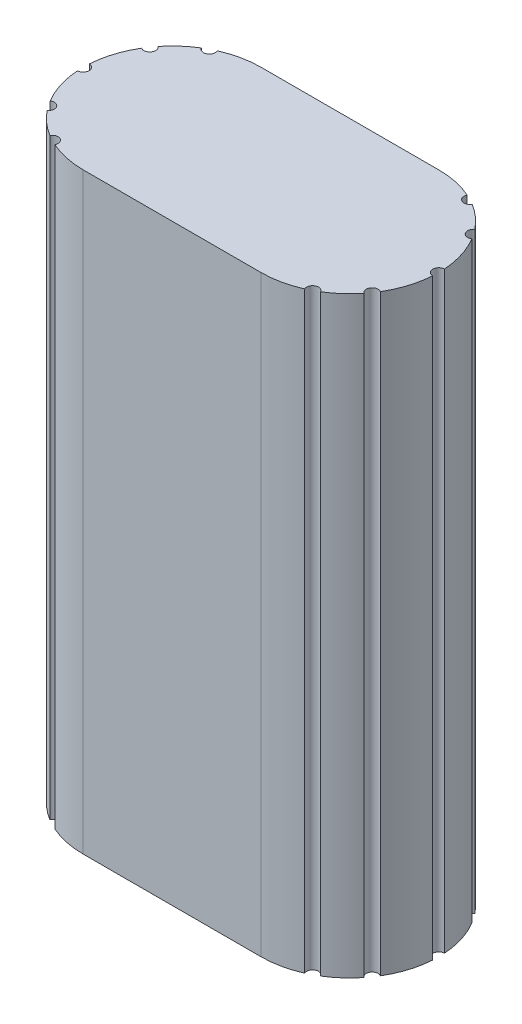
ISO-10303-21;
HEADER;
FILE_DESCRIPTION(('STEP AP214'),'2;1');
FILE_NAME('part.step','',(''),(''),'','','');
FILE_SCHEMA(('AUTOMOTIVE_DESIGN { 1 0 10303 214 1 1 1 1 }'));
ENDSEC;
DATA;
#1=APPLICATION_CONTEXT('core data for automotive mechanical design processes');
#2=APPLICATION_PROTOCOL_DEFINITION('international standard','automotive_design',2000,#1);
#3=PRODUCT_CONTEXT('',#1,'mechanical');
#4=PRODUCT('Part','Part','',(#3));
#5=PRODUCT_RELATED_PRODUCT_CATEGORY('part','',(#4));
#6=PRODUCT_DEFINITION_FORMATION('','',#4);
#7=PRODUCT_DEFINITION_CONTEXT('part definition',#1,'design');
#8=PRODUCT_DEFINITION('design','',#6,#7);
#9=PRODUCT_DEFINITION_SHAPE('','',#8);
#10=(LENGTH_UNIT() NAMED_UNIT(*) SI_UNIT(.MILLI.,.METRE.));
#11=(NAMED_UNIT(*) PLANE_ANGLE_UNIT() SI_UNIT($,.RADIAN.));
#12=(NAMED_UNIT(*) SI_UNIT($,.STERADIAN.) SOLID_ANGLE_UNIT());
#13=UNCERTAINTY_MEASURE_WITH_UNIT(LENGTH_MEASURE(1.E-05),#10,'distance_accuracy_value','');
#14=(GEOMETRIC_REPRESENTATION_CONTEXT(3) GLOBAL_UNCERTAINTY_ASSIGNED_CONTEXT((#13)) GLOBAL_UNIT_ASSIGNED_CONTEXT((#10,
#11,#12)) REPRESENTATION_CONTEXT('',''));
#15=CARTESIAN_POINT('',(0.,0.,0.));
#16=DIRECTION('',(0.,0.,1.));
#17=DIRECTION('',(1.,0.,0.));
#18=AXIS2_PLACEMENT_3D('',#15,#16,#17);
#19=CARTESIAN_POINT('',(15.,100.,0.));
#20=DIRECTION('',(0.,-1.,0.));
#21=DIRECTION('',(0.,0.,-1.));
#22=AXIS2_PLACEMENT_3D('',#19,#20,#21);
#23=CYLINDRICAL_SURFACE('',#22,15.);
#24=CARTESIAN_POINT('',(15.,0.,0.));
#25=DIRECTION('',(0.,1.,0.));
#26=DIRECTION('',(0.,0.,1.));
#27=AXIS2_PLACEMENT_3D('',#24,#25,#26);
#28=CIRCLE('',#27,15.);
#29=CARTESIAN_POINT('',(26.7246512257191,0.,-9.35588337011761));
#30=VERTEX_POINT('',#29);
#31=CARTESIAN_POINT('',(22.8513458778953,0.,-12.7810941591734));
#32=VERTEX_POINT('',#31);
#33=EDGE_CURVE('E277',#30,#32,#28,.T.);
#34=ORIENTED_EDGE('',*,*,#33,.T.);
#35=DIRECTION('',(0.,1.,0.));
#36=VECTOR('',#35,1.);
#37=CARTESIAN_POINT('',(22.8513458778952,50.,-12.7810941591734));
#38=LINE('',#37,#36);
#39=CARTESIAN_POINT('',(22.8513458778952,100.,-12.7810941591734));
#40=VERTEX_POINT('',#39);
#41=EDGE_CURVE('E278',#32,#40,#38,.T.);
#42=ORIENTED_EDGE('',*,*,#41,.T.);
#43=CARTESIAN_POINT('',(15.,100.,0.));
#44=DIRECTION('',(0.,1.,0.));
#45=DIRECTION('',(0.,0.,1.));
#46=AXIS2_PLACEMENT_3D('',#43,#44,#45);
#47=CIRCLE('',#46,15.);
#48=CARTESIAN_POINT('',(26.7246512257191,100.,-9.35588337011761));
#49=VERTEX_POINT('',#48);
#50=EDGE_CURVE('E355',#49,#40,#47,.T.);
#51=ORIENTED_EDGE('',*,*,#50,.F.);
#52=DIRECTION('',(0.,1.,0.));
#53=VECTOR('',#52,1.);
#54=CARTESIAN_POINT('',(26.7246512257191,50.,-9.35588337011761));
#55=LINE('',#54,#53);
#56=EDGE_CURVE('E337',#49,#30,#55,.F.);
#57=ORIENTED_EDGE('',*,*,#56,.T.);
#58=EDGE_LOOP('',(#34,#42,#51,#57));
#59=FACE_BOUND('',#58,.T.);
#60=ADVANCED_FACE('F33',(#59),#23,.T.);
#61=CARTESIAN_POINT('',(29.9666666666667,0.,-0.99944429003768));
#62=VERTEX_POINT('',#61);
#63=CARTESIAN_POINT('',(27.8645352246402,0.,-7.71386631035257));
#64=VERTEX_POINT('',#63);
#65=EDGE_CURVE('E283',#62,#64,#28,.T.);
#66=ORIENTED_EDGE('',*,*,#65,.T.);
#67=DIRECTION('',(0.,1.,0.));
#68=VECTOR('',#67,1.);
#69=CARTESIAN_POINT('',(27.8645352246402,50.,-7.71386631035259));
#70=LINE('',#69,#68);
#71=CARTESIAN_POINT('',(27.8645352246402,100.,-7.71386631035259));
#72=VERTEX_POINT('',#71);
#73=EDGE_CURVE('E290',#64,#72,#70,.T.);
#74=ORIENTED_EDGE('',*,*,#73,.T.);
#75=CARTESIAN_POINT('',(29.9666666666667,100.,-0.99944429003768));
#76=VERTEX_POINT('',#75);
#77=EDGE_CURVE('E345',#76,#72,#47,.T.);
#78=ORIENTED_EDGE('',*,*,#77,.F.);
#79=DIRECTION('',(0.,1.,0.));
#80=VECTOR('',#79,1.);
#81=CARTESIAN_POINT('',(29.9666666666667,50.,-0.99944429003768));
#82=LINE('',#81,#80);
#83=EDGE_CURVE('E331',#76,#62,#82,.F.);
#84=ORIENTED_EDGE('',*,*,#83,.T.);
#85=EDGE_LOOP('',(#66,#74,#78,#84));
#86=FACE_BOUND('',#85,.T.);
#87=ADVANCED_FACE('F344',(#86),#23,.T.);
#88=CARTESIAN_POINT('',(27.8645352246402,0.,7.71386631035257));
#89=VERTEX_POINT('',#88);
#90=CARTESIAN_POINT('',(29.9666666666667,0.,0.99944429003765));
#91=VERTEX_POINT('',#90);
#92=EDGE_CURVE('E275',#89,#91,#28,.T.);
#93=ORIENTED_EDGE('',*,*,#92,.T.);
#94=DIRECTION('',(0.,1.,0.));
#95=VECTOR('',#94,1.);
#96=CARTESIAN_POINT('',(29.9666666666667,50.,0.99944429003765));
#97=LINE('',#96,#95);
#98=CARTESIAN_POINT('',(29.9666666666667,100.,0.99944429003765));
#99=VERTEX_POINT('',#98);
#100=EDGE_CURVE('E334',#91,#99,#97,.T.);
#101=ORIENTED_EDGE('',*,*,#100,.T.);
#102=CARTESIAN_POINT('',(27.8645352246402,100.,7.71386631035257));
#103=VERTEX_POINT('',#102);
#104=EDGE_CURVE('E354',#103,#99,#47,.T.);
#105=ORIENTED_EDGE('',*,*,#104,.F.);
#106=DIRECTION('',(0.,1.,0.));
#107=VECTOR('',#106,1.);
#108=CARTESIAN_POINT('',(27.8645352246402,50.,7.71386631035257));
#109=LINE('',#108,#107);
#110=EDGE_CURVE('E318',#103,#89,#109,.F.);
#111=ORIENTED_EDGE('',*,*,#110,.T.);
#112=EDGE_LOOP('',(#93,#101,#105,#111));
#113=FACE_BOUND('',#112,.T.);
#114=ADVANCED_FACE('F380',(#113),#23,.T.);
#115=CARTESIAN_POINT('',(22.8513458778953,0.,12.7810941591734));
#116=VERTEX_POINT('',#115);
#117=CARTESIAN_POINT('',(26.7246512257191,0.,9.35588337011761));
#118=VERTEX_POINT('',#117);
#119=EDGE_CURVE('E269',#116,#118,#28,.T.);
#120=ORIENTED_EDGE('',*,*,#119,.T.);
#121=DIRECTION('',(0.,1.,0.));
#122=VECTOR('',#121,1.);
#123=CARTESIAN_POINT('',(26.7246512257191,50.,9.35588337011759));
#124=LINE('',#123,#122);
#125=CARTESIAN_POINT('',(26.7246512257191,100.,9.35588337011759));
#126=VERTEX_POINT('',#125);
#127=EDGE_CURVE('E322',#118,#126,#124,.T.);
#128=ORIENTED_EDGE('',*,*,#127,.T.);
#129=CARTESIAN_POINT('',(22.8513458778953,100.,12.7810941591734));
#130=VERTEX_POINT('',#129);
#131=EDGE_CURVE('E298',#130,#126,#47,.T.);
#132=ORIENTED_EDGE('',*,*,#131,.F.);
#133=DIRECTION('',(0.,1.,0.));
#134=VECTOR('',#133,1.);
#135=CARTESIAN_POINT('',(22.8513458778953,50.,12.7810941591734));
#136=LINE('',#135,#134);
#137=EDGE_CURVE('E319',#130,#116,#136,.F.);
#138=ORIENTED_EDGE('',*,*,#137,.T.);
#139=EDGE_LOOP('',(#120,#128,#132,#138));
#140=FACE_BOUND('',#139,.T.);
#141=ADVANCED_FACE('F373',(#140),#23,.T.);
#142=CARTESIAN_POINT('',(15.,0.,15.));
#143=VERTEX_POINT('',#142);
#144=CARTESIAN_POINT('',(21.082219690266,0.,13.7115500086365));
#145=VERTEX_POINT('',#144);
#146=EDGE_CURVE('E264',#143,#145,#28,.T.);
#147=ORIENTED_EDGE('',*,*,#146,.T.);
#148=DIRECTION('',(0.,1.,0.));
#149=VECTOR('',#148,1.);
#150=CARTESIAN_POINT('',(21.082219690266,50.,13.7115500086365));
#151=LINE('',#150,#149);
#152=CARTESIAN_POINT('',(21.082219690266,100.,13.7115500086365));
#153=VERTEX_POINT('',#152);
#154=EDGE_CURVE('E316',#145,#153,#151,.T.);
#155=ORIENTED_EDGE('',*,*,#154,.T.);
#156=CARTESIAN_POINT('',(15.,100.,15.));
#157=VERTEX_POINT('',#156);
#158=EDGE_CURVE('E294',#157,#153,#47,.T.);
#159=ORIENTED_EDGE('',*,*,#158,.F.);
#160=DIRECTION('',(0.,-1.,0.));
#161=VECTOR('',#160,1.);
#162=CARTESIAN_POINT('',(15.,100.,15.));
#163=LINE('',#162,#161);
#164=EDGE_CURVE('E234',#157,#143,#163,.T.);
#165=ORIENTED_EDGE('',*,*,#164,.T.);
#166=EDGE_LOOP('',(#147,#155,#159,#165));
#167=FACE_BOUND('',#166,.T.);
#168=ADVANCED_FACE('F315',(#167),#23,.T.);
#169=CARTESIAN_POINT('',(-15.,100.,0.));
#170=DIRECTION('',(0.,-1.,0.));
#171=DIRECTION('',(0.,0.,-1.));
#172=AXIS2_PLACEMENT_3D('',#169,#170,#171);
#173=CYLINDRICAL_SURFACE('',#172,15.);
#174=CARTESIAN_POINT('',(-15.,0.,0.));
#175=DIRECTION('',(0.,1.,0.));
#176=DIRECTION('',(0.,0.,1.));
#177=AXIS2_PLACEMENT_3D('',#174,#175,#176);
#178=CIRCLE('',#177,15.);
#179=CARTESIAN_POINT('',(-27.8645352246402,0.,-7.71386631035258));
#180=VERTEX_POINT('',#179);
#181=CARTESIAN_POINT('',(-29.9666666666667,0.,-0.999444290037663));
#182=VERTEX_POINT('',#181);
#183=EDGE_CURVE('E222',#180,#182,#178,.T.);
#184=ORIENTED_EDGE('',*,*,#183,.T.);
#185=DIRECTION('',(0.,1.,0.));
#186=VECTOR('',#185,1.);
#187=CARTESIAN_POINT('',(-29.9666666666667,50.,-0.999444290037662));
#188=LINE('',#187,#186);
#189=CARTESIAN_POINT('',(-29.9666666666667,100.,-0.999444290037662));
#190=VERTEX_POINT('',#189);
#191=EDGE_CURVE('E325',#182,#190,#188,.T.);
#192=ORIENTED_EDGE('',*,*,#191,.T.);
#193=CARTESIAN_POINT('',(-15.,100.,0.));
#194=DIRECTION('',(0.,1.,0.));
#195=DIRECTION('',(0.,0.,1.));
#196=AXIS2_PLACEMENT_3D('',#193,#194,#195);
#197=CIRCLE('',#196,15.);
#198=CARTESIAN_POINT('',(-27.8645352246402,100.,-7.71386631035258));
#199=VERTEX_POINT('',#198);
#200=EDGE_CURVE('E430',#199,#190,#197,.T.);
#201=ORIENTED_EDGE('',*,*,#200,.F.);
#202=DIRECTION('',(0.,1.,0.));
#203=VECTOR('',#202,1.);
#204=CARTESIAN_POINT('',(-27.8645352246402,50.,-7.71386631035258));
#205=LINE('',#204,#203);
#206=EDGE_CURVE('E419',#199,#180,#205,.F.);
#207=ORIENTED_EDGE('',*,*,#206,.T.);
#208=EDGE_LOOP('',(#184,#192,#201,#207));
#209=FACE_BOUND('',#208,.T.);
#210=ADVANCED_FACE('F372',(#209),#173,.T.);
#211=CARTESIAN_POINT('',(-26.7246512257191,0.,9.35588337011761));
#212=VERTEX_POINT('',#211);
#213=CARTESIAN_POINT('',(-22.8513458778953,0.,12.7810941591734));
#214=VERTEX_POINT('',#213);
#215=EDGE_CURVE('E251',#212,#214,#178,.T.);
#216=ORIENTED_EDGE('',*,*,#215,.T.);
#217=DIRECTION('',(0.,1.,0.));
#218=VECTOR('',#217,1.);
#219=CARTESIAN_POINT('',(-22.8513458778952,50.,12.7810941591734));
#220=LINE('',#219,#218);
#221=CARTESIAN_POINT('',(-22.8513458778952,100.,12.7810941591734));
#222=VERTEX_POINT('',#221);
#223=EDGE_CURVE('E48',#214,#222,#220,.T.);
#224=ORIENTED_EDGE('',*,*,#223,.T.);
#225=CARTESIAN_POINT('',(-26.7246512257191,100.,9.35588337011761));
#226=VERTEX_POINT('',#225);
#227=EDGE_CURVE('E437',#226,#222,#197,.T.);
#228=ORIENTED_EDGE('',*,*,#227,.F.);
#229=DIRECTION('',(0.,1.,0.));
#230=VECTOR('',#229,1.);
#231=CARTESIAN_POINT('',(-26.7246512257191,50.,9.35588337011761));
#232=LINE('',#231,#230);
#233=EDGE_CURVE('E416',#226,#212,#232,.F.);
#234=ORIENTED_EDGE('',*,*,#233,.T.);
#235=EDGE_LOOP('',(#216,#224,#228,#234));
#236=FACE_BOUND('',#235,.T.);
#237=ADVANCED_FACE('F378',(#236),#173,.T.);
#238=CARTESIAN_POINT('',(-22.8513458778952,0.,-12.7810941591734));
#239=VERTEX_POINT('',#238);
#240=CARTESIAN_POINT('',(-26.7246512257191,0.,-9.35588337011762));
#241=VERTEX_POINT('',#240);
#242=EDGE_CURVE('E212',#239,#241,#178,.T.);
#243=ORIENTED_EDGE('',*,*,#242,.T.);
#244=DIRECTION('',(0.,1.,0.));
#245=VECTOR('',#244,1.);
#246=CARTESIAN_POINT('',(-26.7246512257191,50.,-9.3558833701176));
#247=LINE('',#246,#245);
#248=CARTESIAN_POINT('',(-26.7246512257191,100.,-9.3558833701176));
#249=VERTEX_POINT('',#248);
#250=EDGE_CURVE('E422',#241,#249,#247,.T.);
#251=ORIENTED_EDGE('',*,*,#250,.T.);
#252=CARTESIAN_POINT('',(-22.8513458778952,100.,-12.7810941591734));
#253=VERTEX_POINT('',#252);
#254=EDGE_CURVE('E214',#253,#249,#197,.T.);
#255=ORIENTED_EDGE('',*,*,#254,.F.);
#256=DIRECTION('',(0.,1.,0.));
#257=VECTOR('',#256,1.);
#258=CARTESIAN_POINT('',(-22.8513458778952,50.,-12.7810941591734));
#259=LINE('',#258,#257);
#260=EDGE_CURVE('E196',#253,#239,#259,.F.);
#261=ORIENTED_EDGE('',*,*,#260,.T.);
#262=EDGE_LOOP('',(#243,#251,#255,#261));
#263=FACE_BOUND('',#262,.T.);
#264=ADVANCED_FACE('F210',(#263),#173,.T.);
#265=CARTESIAN_POINT('',(-29.9666666666667,100.,0.999444290037667));
#266=VERTEX_POINT('',#265);
#267=CARTESIAN_POINT('',(-27.8645352246402,100.,7.71386631035259));
#268=VERTEX_POINT('',#267);
#269=EDGE_CURVE('E436',#266,#268,#197,.T.);
#270=ORIENTED_EDGE('',*,*,#269,.F.);
#271=DIRECTION('',(0.,1.,0.));
#272=VECTOR('',#271,1.);
#273=CARTESIAN_POINT('',(-29.9666666666667,50.,0.999444290037667));
#274=LINE('',#273,#272);
#275=CARTESIAN_POINT('',(-29.9666666666667,0.,0.999444290037667));
#276=VERTEX_POINT('',#275);
#277=EDGE_CURVE('E258',#266,#276,#274,.F.);
#278=ORIENTED_EDGE('',*,*,#277,.T.);
#279=CARTESIAN_POINT('',(-27.8645352246402,0.,7.71386631035256));
#280=VERTEX_POINT('',#279);
#281=EDGE_CURVE('E227',#276,#280,#178,.T.);
#282=ORIENTED_EDGE('',*,*,#281,.T.);
#283=DIRECTION('',(0.,1.,0.));
#284=VECTOR('',#283,1.);
#285=CARTESIAN_POINT('',(-27.8645352246402,50.,7.71386631035259));
#286=LINE('',#285,#284);
#287=EDGE_CURVE('E56',#280,#268,#286,.T.);
#288=ORIENTED_EDGE('',*,*,#287,.T.);
#289=EDGE_LOOP('',(#270,#278,#282,#288));
#290=FACE_BOUND('',#289,.T.);
#291=ADVANCED_FACE('F256',(#290),#173,.T.);
#292=CARTESIAN_POINT('',(-15.,0.,-15.));
#293=VERTEX_POINT('',#292);
#294=CARTESIAN_POINT('',(-21.082219690266,0.,-13.7115500086365));
#295=VERTEX_POINT('',#294);
#296=EDGE_CURVE('E221',#293,#295,#178,.T.);
#297=ORIENTED_EDGE('',*,*,#296,.T.);
#298=DIRECTION('',(0.,1.,0.));
#299=VECTOR('',#298,1.);
#300=CARTESIAN_POINT('',(-21.082219690266,50.,-13.7115500086365));
#301=LINE('',#300,#299);
#302=CARTESIAN_POINT('',(-21.082219690266,100.,-13.7115500086365));
#303=VERTEX_POINT('',#302);
#304=EDGE_CURVE('E199',#295,#303,#301,.T.);
#305=ORIENTED_EDGE('',*,*,#304,.T.);
#306=CARTESIAN_POINT('',(-15.,100.,-15.));
#307=VERTEX_POINT('',#306);
#308=EDGE_CURVE('E301',#307,#303,#197,.T.);
#309=ORIENTED_EDGE('',*,*,#308,.F.);
#310=DIRECTION('',(0.,-1.,0.));
#311=VECTOR('',#310,1.);
#312=CARTESIAN_POINT('',(-15.,100.,-15.));
#313=LINE('',#312,#311);
#314=EDGE_CURVE('E241',#307,#293,#313,.T.);
#315=ORIENTED_EDGE('',*,*,#314,.T.);
#316=EDGE_LOOP('',(#297,#305,#309,#315));
#317=FACE_BOUND('',#316,.T.);
#318=ADVANCED_FACE('F362',(#317),#173,.T.);
#319=CARTESIAN_POINT('',(21.082219690266,100.,-13.7115500086365));
#320=VERTEX_POINT('',#319);
#321=CARTESIAN_POINT('',(15.,100.,-15.));
#322=VERTEX_POINT('',#321);
#323=EDGE_CURVE('E233',#320,#322,#47,.T.);
#324=ORIENTED_EDGE('',*,*,#323,.F.);
#325=DIRECTION('',(0.,1.,0.));
#326=VECTOR('',#325,1.);
#327=CARTESIAN_POINT('',(21.082219690266,50.,-13.7115500086365));
#328=LINE('',#327,#326);
#329=CARTESIAN_POINT('',(21.082219690266,0.,-13.7115500086365));
#330=VERTEX_POINT('',#329);
#331=EDGE_CURVE('E285',#320,#330,#328,.F.);
#332=ORIENTED_EDGE('',*,*,#331,.T.);
#333=CARTESIAN_POINT('',(15.,0.,-15.));
#334=VERTEX_POINT('',#333);
#335=EDGE_CURVE('E270',#330,#334,#28,.T.);
#336=ORIENTED_EDGE('',*,*,#335,.T.);
#337=DIRECTION('',(0.,-1.,0.));
#338=VECTOR('',#337,1.);
#339=CARTESIAN_POINT('',(15.,100.,-15.));
#340=LINE('',#339,#338);
#341=EDGE_CURVE('E205',#322,#334,#340,.T.);
#342=ORIENTED_EDGE('',*,*,#341,.F.);
#343=EDGE_LOOP('',(#324,#332,#336,#342));
#344=FACE_BOUND('',#343,.T.);
#345=ADVANCED_FACE('F35',(#344),#23,.T.);
#346=CARTESIAN_POINT('',(15.,100.,-15.));
#347=DIRECTION('',(0.,0.,1.));
#348=DIRECTION('',(1.,0.,0.));
#349=AXIS2_PLACEMENT_3D('',#346,#347,#348);
#350=PLANE('',#349);
#351=DIRECTION('',(-1.,0.,0.));
#352=VECTOR('',#351,1.);
#353=CARTESIAN_POINT('',(15.,0.,-15.));
#354=LINE('',#353,#352);
#355=EDGE_CURVE('E230',#334,#293,#354,.T.);
#356=ORIENTED_EDGE('',*,*,#355,.T.);
#357=ORIENTED_EDGE('',*,*,#314,.F.);
#358=DIRECTION('',(-1.,0.,0.));
#359=VECTOR('',#358,1.);
#360=CARTESIAN_POINT('',(15.,100.,-15.));
#361=LINE('',#360,#359);
#362=EDGE_CURVE('E297',#322,#307,#361,.T.);
#363=ORIENTED_EDGE('',*,*,#362,.F.);
#364=ORIENTED_EDGE('',*,*,#341,.T.);
#365=EDGE_LOOP('',(#356,#357,#363,#364));
#366=FACE_BOUND('',#365,.T.);
#367=ADVANCED_FACE('F359',(#366),#350,.F.);
#368=CARTESIAN_POINT('',(-21.082219690266,100.,13.7115500086365));
#369=VERTEX_POINT('',#368);
#370=CARTESIAN_POINT('',(-15.,100.,15.));
#371=VERTEX_POINT('',#370);
#372=EDGE_CURVE('E300',#369,#371,#197,.T.);
#373=ORIENTED_EDGE('',*,*,#372,.F.);
#374=DIRECTION('',(0.,1.,0.));
#375=VECTOR('',#374,1.);
#376=CARTESIAN_POINT('',(-21.082219690266,50.,13.7115500086365));
#377=LINE('',#376,#375);
#378=CARTESIAN_POINT('',(-21.082219690266,0.,13.7115500086365));
#379=VERTEX_POINT('',#378);
#380=EDGE_CURVE('E424',#369,#379,#377,.F.);
#381=ORIENTED_EDGE('',*,*,#380,.T.);
#382=CARTESIAN_POINT('',(-15.,0.,15.));
#383=VERTEX_POINT('',#382);
#384=EDGE_CURVE('E225',#379,#383,#178,.T.);
#385=ORIENTED_EDGE('',*,*,#384,.T.);
#386=DIRECTION('',(0.,-1.,0.));
#387=VECTOR('',#386,1.);
#388=CARTESIAN_POINT('',(-15.,100.,15.));
#389=LINE('',#388,#387);
#390=EDGE_CURVE('E237',#371,#383,#389,.T.);
#391=ORIENTED_EDGE('',*,*,#390,.F.);
#392=EDGE_LOOP('',(#373,#381,#385,#391));
#393=FACE_BOUND('',#392,.T.);
#394=ADVANCED_FACE('F367',(#393),#173,.T.);
#395=CARTESIAN_POINT('',(15.,100.,15.));
#396=DIRECTION('',(0.,0.,-1.));
#397=DIRECTION('',(-1.,0.,0.));
#398=AXIS2_PLACEMENT_3D('',#395,#396,#397);
#399=PLANE('',#398);
#400=DIRECTION('',(1.,0.,0.));
#401=VECTOR('',#400,1.);
#402=CARTESIAN_POINT('',(15.,0.,15.));
#403=LINE('',#402,#401);
#404=EDGE_CURVE('E224',#383,#143,#403,.T.);
#405=ORIENTED_EDGE('',*,*,#404,.T.);
#406=ORIENTED_EDGE('',*,*,#164,.F.);
#407=DIRECTION('',(1.,0.,0.));
#408=VECTOR('',#407,1.);
#409=CARTESIAN_POINT('',(15.,100.,15.));
#410=LINE('',#409,#408);
#411=EDGE_CURVE('E238',#371,#157,#410,.T.);
#412=ORIENTED_EDGE('',*,*,#411,.F.);
#413=ORIENTED_EDGE('',*,*,#390,.T.);
#414=EDGE_LOOP('',(#405,#406,#412,#413));
#415=FACE_BOUND('',#414,.T.);
#416=ADVANCED_FACE('F313',(#415),#399,.F.);
#417=CARTESIAN_POINT('',(15.,100.,0.));
#418=DIRECTION('',(0.,1.,0.));
#419=DIRECTION('',(0.,0.,1.));
#420=AXIS2_PLACEMENT_3D('',#417,#418,#419);
#421=PLANE('',#420);
#422=CARTESIAN_POINT('',(21.9822990040897,100.,-13.2758239148268));
#423=DIRECTION('',(0.,1.,0.));
#424=DIRECTION('',(0.,0.,-1.));
#425=AXIS2_PLACEMENT_3D('',#422,#423,#424);
#426=CIRCLE('',#425,1.);
#427=EDGE_CURVE('E358',#320,#40,#426,.T.);
#428=ORIENTED_EDGE('',*,*,#427,.F.);
#429=ORIENTED_EDGE('',*,*,#323,.T.);
#430=ORIENTED_EDGE('',*,*,#362,.T.);
#431=ORIENTED_EDGE('',*,*,#308,.T.);
#432=CARTESIAN_POINT('',(-21.9822990040897,100.,-13.2758239148268));
#433=DIRECTION('',(0.,1.,0.));
#434=DIRECTION('',(0.,0.,1.));
#435=AXIS2_PLACEMENT_3D('',#432,#433,#434);
#436=CIRCLE('',#435,1.);
#437=EDGE_CURVE('E215',#253,#303,#436,.T.);
#438=ORIENTED_EDGE('',*,*,#437,.F.);
#439=ORIENTED_EDGE('',*,*,#254,.T.);
#440=CARTESIAN_POINT('',(-27.321975392719,100.,-8.5538834701688));
#441=DIRECTION('',(0.,1.,0.));
#442=DIRECTION('',(0.,0.,1.));
#443=AXIS2_PLACEMENT_3D('',#440,#441,#442);
#444=CIRCLE('',#443,1.);
#445=EDGE_CURVE('E435',#199,#249,#444,.T.);
#446=ORIENTED_EDGE('',*,*,#445,.F.);
#447=ORIENTED_EDGE('',*,*,#200,.T.);
#448=CARTESIAN_POINT('',(-30.,100.,0.));
#449=DIRECTION('',(0.,1.,0.));
#450=DIRECTION('',(0.,0.,1.));
#451=AXIS2_PLACEMENT_3D('',#448,#449,#450);
#452=CIRCLE('',#451,1.);
#453=EDGE_CURVE('E434',#266,#190,#452,.T.);
#454=ORIENTED_EDGE('',*,*,#453,.F.);
#455=ORIENTED_EDGE('',*,*,#269,.T.);
#456=CARTESIAN_POINT('',(-27.321975392719,100.,8.5538834701688));
#457=DIRECTION('',(0.,1.,0.));
#458=DIRECTION('',(0.,0.,-1.));
#459=AXIS2_PLACEMENT_3D('',#456,#457,#458);
#460=CIRCLE('',#459,1.);
#461=EDGE_CURVE('E398',#226,#268,#460,.T.);
#462=ORIENTED_EDGE('',*,*,#461,.F.);
#463=ORIENTED_EDGE('',*,*,#227,.T.);
#464=CARTESIAN_POINT('',(-21.9822990040897,100.,13.2758239148268));
#465=DIRECTION('',(0.,1.,0.));
#466=DIRECTION('',(0.,0.,1.));
#467=AXIS2_PLACEMENT_3D('',#464,#465,#466);
#468=CIRCLE('',#467,1.);
#469=EDGE_CURVE('E441',#369,#222,#468,.T.);
#470=ORIENTED_EDGE('',*,*,#469,.F.);
#471=ORIENTED_EDGE('',*,*,#372,.T.);
#472=ORIENTED_EDGE('',*,*,#411,.T.);
#473=ORIENTED_EDGE('',*,*,#158,.T.);
#474=CARTESIAN_POINT('',(21.9822990040897,100.,13.2758239148268));
#475=DIRECTION('',(0.,1.,0.));
#476=DIRECTION('',(0.,0.,-1.));
#477=AXIS2_PLACEMENT_3D('',#474,#475,#476);
#478=CIRCLE('',#477,1.);
#479=EDGE_CURVE('E395',#130,#153,#478,.T.);
#480=ORIENTED_EDGE('',*,*,#479,.F.);
#481=ORIENTED_EDGE('',*,*,#131,.T.);
#482=CARTESIAN_POINT('',(27.321975392719,100.,8.55388347016878));
#483=DIRECTION('',(0.,1.,0.));
#484=DIRECTION('',(0.,0.,1.));
#485=AXIS2_PLACEMENT_3D('',#482,#483,#484);
#486=CIRCLE('',#485,1.);
#487=EDGE_CURVE('E396',#103,#126,#486,.T.);
#488=ORIENTED_EDGE('',*,*,#487,.F.);
#489=ORIENTED_EDGE('',*,*,#104,.T.);
#490=CARTESIAN_POINT('',(30.,100.,0.));
#491=DIRECTION('',(0.,1.,0.));
#492=DIRECTION('',(0.,0.,-1.));
#493=AXIS2_PLACEMENT_3D('',#490,#491,#492);
#494=CIRCLE('',#493,1.);
#495=EDGE_CURVE('E353',#76,#99,#494,.T.);
#496=ORIENTED_EDGE('',*,*,#495,.F.);
#497=ORIENTED_EDGE('',*,*,#77,.T.);
#498=CARTESIAN_POINT('',(27.321975392719,100.,-8.55388347016881));
#499=DIRECTION('',(0.,1.,0.));
#500=DIRECTION('',(0.,0.,-1.));
#501=AXIS2_PLACEMENT_3D('',#498,#499,#500);
#502=CIRCLE('',#501,1.);
#503=EDGE_CURVE('E351',#49,#72,#502,.T.);
#504=ORIENTED_EDGE('',*,*,#503,.F.);
#505=ORIENTED_EDGE('',*,*,#50,.T.);
#506=EDGE_LOOP('',(#428,#429,#430,#431,#438,#439,#446,#447,#454,#455,#462,#463,#470,#471,#472,
#473,#480,#481,#488,#489,#496,#497,#504,#505));
#507=FACE_BOUND('',#506,.T.);
#508=ADVANCED_FACE('F307',(#507),#421,.T.);
#509=CARTESIAN_POINT('',(15.,0.,0.));
#510=DIRECTION('',(0.,1.,0.));
#511=DIRECTION('',(0.,0.,1.));
#512=AXIS2_PLACEMENT_3D('',#509,#510,#511);
#513=PLANE('',#512);
#514=ORIENTED_EDGE('',*,*,#335,.F.);
#515=CARTESIAN_POINT('',(21.9822990040897,0.,-13.2758239148268));
#516=DIRECTION('',(0.,1.,0.));
#517=DIRECTION('',(0.,0.,-1.));
#518=AXIS2_PLACEMENT_3D('',#515,#516,#517);
#519=CIRCLE('',#518,1.);
#520=EDGE_CURVE('E409',#330,#32,#519,.T.);
#521=ORIENTED_EDGE('',*,*,#520,.T.);
#522=ORIENTED_EDGE('',*,*,#33,.F.);
#523=CARTESIAN_POINT('',(27.321975392719,0.,-8.55388347016881));
#524=DIRECTION('',(0.,1.,0.));
#525=DIRECTION('',(0.,0.,-1.));
#526=AXIS2_PLACEMENT_3D('',#523,#524,#525);
#527=CIRCLE('',#526,1.);
#528=EDGE_CURVE('E406',#30,#64,#527,.T.);
#529=ORIENTED_EDGE('',*,*,#528,.T.);
#530=ORIENTED_EDGE('',*,*,#65,.F.);
#531=CARTESIAN_POINT('',(30.,0.,0.));
#532=DIRECTION('',(0.,1.,0.));
#533=DIRECTION('',(0.,0.,-1.));
#534=AXIS2_PLACEMENT_3D('',#531,#532,#533);
#535=CIRCLE('',#534,1.);
#536=EDGE_CURVE('E400',#62,#91,#535,.T.);
#537=ORIENTED_EDGE('',*,*,#536,.T.);
#538=ORIENTED_EDGE('',*,*,#92,.F.);
#539=CARTESIAN_POINT('',(27.321975392719,0.,8.55388347016878));
#540=DIRECTION('',(0.,1.,0.));
#541=DIRECTION('',(0.,0.,1.));
#542=AXIS2_PLACEMENT_3D('',#539,#540,#541);
#543=CIRCLE('',#542,1.);
#544=EDGE_CURVE('E391',#89,#118,#543,.T.);
#545=ORIENTED_EDGE('',*,*,#544,.T.);
#546=ORIENTED_EDGE('',*,*,#119,.F.);
#547=CARTESIAN_POINT('',(21.9822990040897,0.,13.2758239148268));
#548=DIRECTION('',(0.,1.,0.));
#549=DIRECTION('',(0.,0.,1.));
#550=AXIS2_PLACEMENT_3D('',#547,#548,#549);
#551=CIRCLE('',#550,1.);
#552=EDGE_CURVE('E11',#116,#145,#551,.T.);
#553=ORIENTED_EDGE('',*,*,#552,.T.);
#554=ORIENTED_EDGE('',*,*,#146,.F.);
#555=ORIENTED_EDGE('',*,*,#404,.F.);
#556=ORIENTED_EDGE('',*,*,#384,.F.);
#557=CARTESIAN_POINT('',(-21.9822990040897,0.,13.2758239148268));
#558=DIRECTION('',(0.,1.,0.));
#559=DIRECTION('',(0.,0.,1.));
#560=AXIS2_PLACEMENT_3D('',#557,#558,#559);
#561=CIRCLE('',#560,1.);
#562=EDGE_CURVE('E448',#379,#214,#561,.T.);
#563=ORIENTED_EDGE('',*,*,#562,.T.);
#564=ORIENTED_EDGE('',*,*,#215,.F.);
#565=CARTESIAN_POINT('',(-27.321975392719,0.,8.5538834701688));
#566=DIRECTION('',(0.,1.,0.));
#567=DIRECTION('',(0.,0.,1.));
#568=AXIS2_PLACEMENT_3D('',#565,#566,#567);
#569=CIRCLE('',#568,1.);
#570=EDGE_CURVE('E204',#212,#280,#569,.T.);
#571=ORIENTED_EDGE('',*,*,#570,.T.);
#572=ORIENTED_EDGE('',*,*,#281,.F.);
#573=CARTESIAN_POINT('',(-30.,0.,0.));
#574=DIRECTION('',(0.,1.,0.));
#575=DIRECTION('',(0.,0.,1.));
#576=AXIS2_PLACEMENT_3D('',#573,#574,#575);
#577=CIRCLE('',#576,1.);
#578=EDGE_CURVE('E413',#276,#182,#577,.T.);
#579=ORIENTED_EDGE('',*,*,#578,.T.);
#580=ORIENTED_EDGE('',*,*,#183,.F.);
#581=CARTESIAN_POINT('',(-27.321975392719,0.,-8.5538834701688));
#582=DIRECTION('',(0.,1.,0.));
#583=DIRECTION('',(0.,0.,1.));
#584=AXIS2_PLACEMENT_3D('',#581,#582,#583);
#585=CIRCLE('',#584,1.);
#586=EDGE_CURVE('E41',#180,#241,#585,.T.);
#587=ORIENTED_EDGE('',*,*,#586,.T.);
#588=ORIENTED_EDGE('',*,*,#242,.F.);
#589=CARTESIAN_POINT('',(-21.9822990040897,0.,-13.2758239148268));
#590=DIRECTION('',(0.,1.,0.));
#591=DIRECTION('',(0.,0.,1.));
#592=AXIS2_PLACEMENT_3D('',#589,#590,#591);
#593=CIRCLE('',#592,1.);
#594=EDGE_CURVE('E193',#239,#295,#593,.T.);
#595=ORIENTED_EDGE('',*,*,#594,.T.);
#596=ORIENTED_EDGE('',*,*,#296,.F.);
#597=ORIENTED_EDGE('',*,*,#355,.F.);
#598=EDGE_LOOP('',(#514,#521,#522,#529,#530,#537,#538,#545,#546,#553,#554,#555,#556,#563,#564,
#571,#572,#579,#580,#587,#588,#595,#596,#597));
#599=FACE_BOUND('',#598,.T.);
#600=ADVANCED_FACE('F219',(#599),#513,.F.);
#601=CARTESIAN_POINT('',(-21.9822990040897,0.,-13.2758239148268));
#602=DIRECTION('',(0.,1.,0.));
#603=DIRECTION('',(0.,0.,1.));
#604=AXIS2_PLACEMENT_3D('',#601,#602,#603);
#605=CYLINDRICAL_SURFACE('',#604,1.);
#606=ORIENTED_EDGE('',*,*,#594,.F.);
#607=ORIENTED_EDGE('',*,*,#260,.F.);
#608=ORIENTED_EDGE('',*,*,#437,.T.);
#609=ORIENTED_EDGE('',*,*,#304,.F.);
#610=EDGE_LOOP('',(#606,#607,#608,#609));
#611=FACE_BOUND('',#610,.T.);
#612=ADVANCED_FACE('F195',(#611),#605,.F.);
#613=CARTESIAN_POINT('',(-27.321975392719,0.,8.5538834701688));
#614=DIRECTION('',(0.,1.,0.));
#615=DIRECTION('',(0.,0.,1.));
#616=AXIS2_PLACEMENT_3D('',#613,#614,#615);
#617=CYLINDRICAL_SURFACE('',#616,1.);
#618=ORIENTED_EDGE('',*,*,#570,.F.);
#619=ORIENTED_EDGE('',*,*,#233,.F.);
#620=ORIENTED_EDGE('',*,*,#461,.T.);
#621=ORIENTED_EDGE('',*,*,#287,.F.);
#622=EDGE_LOOP('',(#618,#619,#620,#621));
#623=FACE_BOUND('',#622,.T.);
#624=ADVANCED_FACE('F442',(#623),#617,.F.);
#625=CARTESIAN_POINT('',(-27.321975392719,0.,-8.5538834701688));
#626=DIRECTION('',(0.,1.,0.));
#627=DIRECTION('',(0.,0.,1.));
#628=AXIS2_PLACEMENT_3D('',#625,#626,#627);
#629=CYLINDRICAL_SURFACE('',#628,1.);
#630=ORIENTED_EDGE('',*,*,#586,.F.);
#631=ORIENTED_EDGE('',*,*,#206,.F.);
#632=ORIENTED_EDGE('',*,*,#445,.T.);
#633=ORIENTED_EDGE('',*,*,#250,.F.);
#634=EDGE_LOOP('',(#630,#631,#632,#633));
#635=FACE_BOUND('',#634,.T.);
#636=ADVANCED_FACE('F482',(#635),#629,.F.);
#637=CARTESIAN_POINT('',(-21.9822990040897,0.,13.2758239148268));
#638=DIRECTION('',(0.,1.,0.));
#639=DIRECTION('',(0.,0.,1.));
#640=AXIS2_PLACEMENT_3D('',#637,#638,#639);
#641=CYLINDRICAL_SURFACE('',#640,1.);
#642=ORIENTED_EDGE('',*,*,#562,.F.);
#643=ORIENTED_EDGE('',*,*,#380,.F.);
#644=ORIENTED_EDGE('',*,*,#469,.T.);
#645=ORIENTED_EDGE('',*,*,#223,.F.);
#646=EDGE_LOOP('',(#642,#643,#644,#645));
#647=FACE_BOUND('',#646,.T.);
#648=ADVANCED_FACE('F449',(#647),#641,.F.);
#649=CARTESIAN_POINT('',(-30.,0.,0.));
#650=DIRECTION('',(0.,1.,0.));
#651=DIRECTION('',(0.,0.,1.));
#652=AXIS2_PLACEMENT_3D('',#649,#650,#651);
#653=CYLINDRICAL_SURFACE('',#652,1.);
#654=ORIENTED_EDGE('',*,*,#578,.F.);
#655=ORIENTED_EDGE('',*,*,#277,.F.);
#656=ORIENTED_EDGE('',*,*,#453,.T.);
#657=ORIENTED_EDGE('',*,*,#191,.F.);
#658=EDGE_LOOP('',(#654,#655,#656,#657));
#659=FACE_BOUND('',#658,.T.);
#660=ADVANCED_FACE('F479',(#659),#653,.F.);
#661=CARTESIAN_POINT('',(21.9822990040897,0.,13.2758239148268));
#662=DIRECTION('',(0.,1.,0.));
#663=DIRECTION('',(0.,0.,1.));
#664=AXIS2_PLACEMENT_3D('',#661,#662,#663);
#665=CYLINDRICAL_SURFACE('',#664,1.);
#666=ORIENTED_EDGE('',*,*,#552,.F.);
#667=ORIENTED_EDGE('',*,*,#137,.F.);
#668=ORIENTED_EDGE('',*,*,#479,.T.);
#669=ORIENTED_EDGE('',*,*,#154,.F.);
#670=EDGE_LOOP('',(#666,#667,#668,#669));
#671=FACE_BOUND('',#670,.T.);
#672=ADVANCED_FACE('F476',(#671),#665,.F.);
#673=CARTESIAN_POINT('',(27.321975392719,0.,8.55388347016878));
#674=DIRECTION('',(0.,1.,0.));
#675=DIRECTION('',(0.,0.,1.));
#676=AXIS2_PLACEMENT_3D('',#673,#674,#675);
#677=CYLINDRICAL_SURFACE('',#676,1.);
#678=ORIENTED_EDGE('',*,*,#544,.F.);
#679=ORIENTED_EDGE('',*,*,#110,.F.);
#680=ORIENTED_EDGE('',*,*,#487,.T.);
#681=ORIENTED_EDGE('',*,*,#127,.F.);
#682=EDGE_LOOP('',(#678,#679,#680,#681));
#683=FACE_BOUND('',#682,.T.);
#684=ADVANCED_FACE('F472',(#683),#677,.F.);
#685=CARTESIAN_POINT('',(30.,0.,0.));
#686=DIRECTION('',(0.,1.,0.));
#687=DIRECTION('',(0.,0.,1.));
#688=AXIS2_PLACEMENT_3D('',#685,#686,#687);
#689=CYLINDRICAL_SURFACE('',#688,1.);
#690=ORIENTED_EDGE('',*,*,#536,.F.);
#691=ORIENTED_EDGE('',*,*,#83,.F.);
#692=ORIENTED_EDGE('',*,*,#495,.T.);
#693=ORIENTED_EDGE('',*,*,#100,.F.);
#694=EDGE_LOOP('',(#690,#691,#692,#693));
#695=FACE_BOUND('',#694,.T.);
#696=ADVANCED_FACE('F469',(#695),#689,.F.);
#697=CARTESIAN_POINT('',(27.321975392719,0.,-8.55388347016881));
#698=DIRECTION('',(0.,1.,0.));
#699=DIRECTION('',(0.,0.,1.));
#700=AXIS2_PLACEMENT_3D('',#697,#698,#699);
#701=CYLINDRICAL_SURFACE('',#700,1.);
#702=ORIENTED_EDGE('',*,*,#528,.F.);
#703=ORIENTED_EDGE('',*,*,#56,.F.);
#704=ORIENTED_EDGE('',*,*,#503,.T.);
#705=ORIENTED_EDGE('',*,*,#73,.F.);
#706=EDGE_LOOP('',(#702,#703,#704,#705));
#707=FACE_BOUND('',#706,.T.);
#708=ADVANCED_FACE('F465',(#707),#701,.F.);
#709=CARTESIAN_POINT('',(21.9822990040897,0.,-13.2758239148268));
#710=DIRECTION('',(0.,1.,0.));
#711=DIRECTION('',(0.,0.,1.));
#712=AXIS2_PLACEMENT_3D('',#709,#710,#711);
#713=CYLINDRICAL_SURFACE('',#712,1.);
#714=ORIENTED_EDGE('',*,*,#520,.F.);
#715=ORIENTED_EDGE('',*,*,#331,.F.);
#716=ORIENTED_EDGE('',*,*,#427,.T.);
#717=ORIENTED_EDGE('',*,*,#41,.F.);
#718=EDGE_LOOP('',(#714,#715,#716,#717));
#719=FACE_BOUND('',#718,.T.);
#720=ADVANCED_FACE('F462',(#719),#713,.F.);
#721=CLOSED_SHELL('',(#60,#87,#114,#141,#168,#210,#237,#264,#291,#318,#345,#367,#394,#416,#508,
#600,#612,#624,#636,#648,#660,#672,#684,#696,#708,#720));
#722=MANIFOLD_SOLID_BREP('B2',#721);
#723=ADVANCED_BREP_SHAPE_REPRESENTATION('',(#18,#722),#14);
#724=SHAPE_DEFINITION_REPRESENTATION(#9,#723);
ENDSEC;
END-ISO-10303-21;
